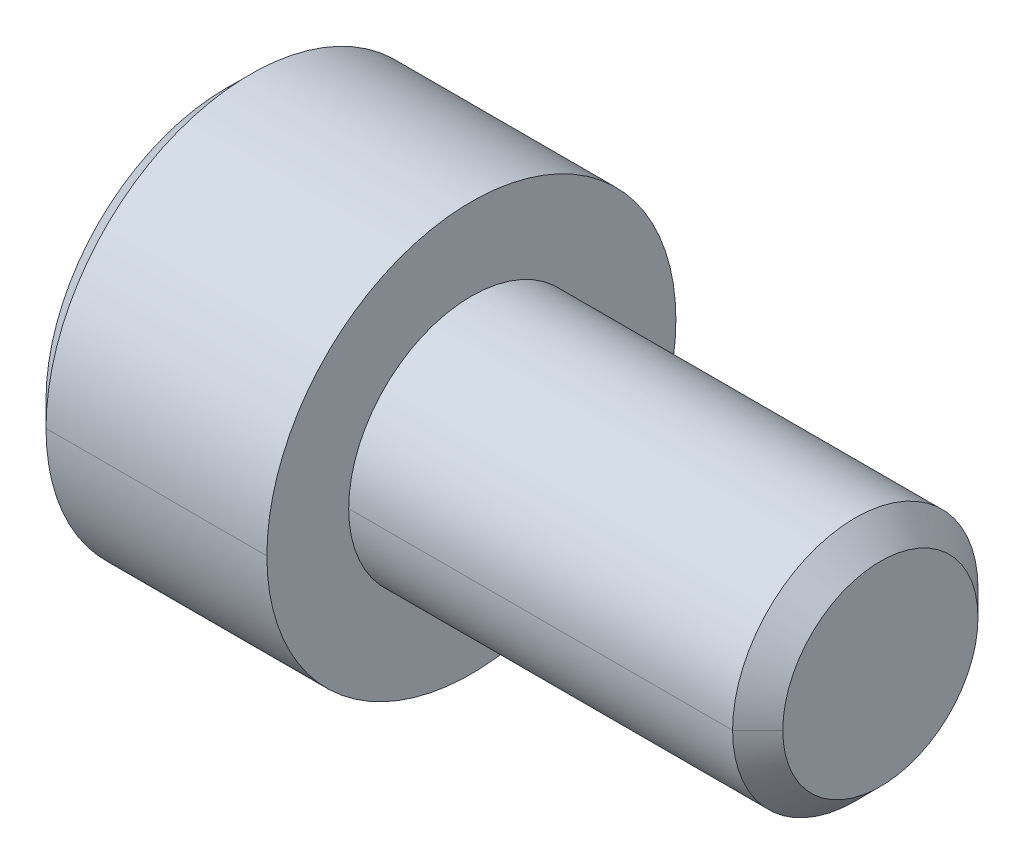
ISO-10303-21;
HEADER;
FILE_DESCRIPTION(('STEP AP214'),'2;1');
FILE_NAME('part.step','',(''),(''),'','','');
FILE_SCHEMA(('AUTOMOTIVE_DESIGN { 1 0 10303 214 1 1 1 1 }'));
ENDSEC;
DATA;
#1=APPLICATION_CONTEXT('core data for automotive mechanical design processes');
#2=APPLICATION_PROTOCOL_DEFINITION('international standard','automotive_design',2000,#1);
#3=PRODUCT_CONTEXT('',#1,'mechanical');
#4=PRODUCT('Part','Part','',(#3));
#5=PRODUCT_RELATED_PRODUCT_CATEGORY('part','',(#4));
#6=PRODUCT_DEFINITION_FORMATION('','',#4);
#7=PRODUCT_DEFINITION_CONTEXT('part definition',#1,'design');
#8=PRODUCT_DEFINITION('design','',#6,#7);
#9=PRODUCT_DEFINITION_SHAPE('','',#8);
#10=(LENGTH_UNIT() NAMED_UNIT(*) SI_UNIT(.MILLI.,.METRE.));
#11=(NAMED_UNIT(*) PLANE_ANGLE_UNIT() SI_UNIT($,.RADIAN.));
#12=(NAMED_UNIT(*) SI_UNIT($,.STERADIAN.) SOLID_ANGLE_UNIT());
#13=UNCERTAINTY_MEASURE_WITH_UNIT(LENGTH_MEASURE(1.E-05),#10,'distance_accuracy_value','');
#14=(GEOMETRIC_REPRESENTATION_CONTEXT(3) GLOBAL_UNCERTAINTY_ASSIGNED_CONTEXT((#13)) GLOBAL_UNIT_ASSIGNED_CONTEXT((#10,
#11,#12)) REPRESENTATION_CONTEXT('',''));
#15=CARTESIAN_POINT('',(0.,0.,0.));
#16=DIRECTION('',(0.,0.,1.));
#17=DIRECTION('',(1.,0.,0.));
#18=AXIS2_PLACEMENT_3D('',#15,#16,#17);
#19=CARTESIAN_POINT('',(-6.,0.,0.));
#20=DIRECTION('',(1.,0.,0.));
#21=DIRECTION('',(0.,-1.,0.));
#22=AXIS2_PLACEMENT_3D('',#19,#20,#21);
#23=CONICAL_SURFACE('',#22,4.4,0.7853981634);
#24=CARTESIAN_POINT('',(-5.4,0.,0.));
#25=DIRECTION('',(1.,0.,0.));
#26=DIRECTION('',(0.,0.,-1.));
#27=AXIS2_PLACEMENT_3D('',#24,#25,#26);
#28=CIRCLE('',#27,5.);
#29=CARTESIAN_POINT('',(-5.4,0.,-5.));
#30=VERTEX_POINT('',#29);
#31=CARTESIAN_POINT('',(-5.40000000000153,0.,5.00000000000153));
#32=VERTEX_POINT('',#31);
#33=EDGE_CURVE('E10',#30,#32,#28,.T.);
#34=ORIENTED_EDGE('',*,*,#33,.F.);
#35=CARTESIAN_POINT('',(-6.,0.,-4.4));
#36=DIRECTION('',(0.707106781184743,0.,-0.707106781188352));
#37=VECTOR('',#36,1.);
#38=LINE('',#35,#37);
#39=CARTESIAN_POINT('',(-6.,0.,-4.4));
#40=VERTEX_POINT('',#39);
#41=EDGE_CURVE('E25',#40,#30,#38,.T.);
#42=ORIENTED_EDGE('',*,*,#41,.F.);
#43=CARTESIAN_POINT('',(-6.,0.,0.));
#44=DIRECTION('',(1.,0.,0.));
#45=DIRECTION('',(0.,0.,-1.));
#46=AXIS2_PLACEMENT_3D('',#43,#44,#45);
#47=CIRCLE('',#46,4.4);
#48=CARTESIAN_POINT('',(-6.,0.,4.4));
#49=VERTEX_POINT('',#48);
#50=EDGE_CURVE('E556',#40,#49,#47,.T.);
#51=ORIENTED_EDGE('',*,*,#50,.T.);
#52=CARTESIAN_POINT('',(-6.,0.,4.4));
#53=DIRECTION('',(0.707106781184743,0.,0.707106781188352));
#54=VECTOR('',#53,1.);
#55=LINE('',#52,#54);
#56=EDGE_CURVE('E543',#49,#32,#55,.T.);
#57=ORIENTED_EDGE('',*,*,#56,.T.);
#58=EDGE_LOOP('',(#34,#42,#51,#57));
#59=FACE_BOUND('',#58,.T.);
#60=ADVANCED_FACE('F16',(#59),#23,.T.);
#61=CARTESIAN_POINT('',(-6.,0.,0.));
#62=DIRECTION('',(1.,0.,0.));
#63=DIRECTION('',(0.,1.,0.));
#64=AXIS2_PLACEMENT_3D('',#61,#62,#63);
#65=CONICAL_SURFACE('',#64,4.4,0.7853981634);
#66=CARTESIAN_POINT('',(-6.,0.,0.));
#67=DIRECTION('',(1.,0.,0.));
#68=DIRECTION('',(0.,0.,-1.));
#69=AXIS2_PLACEMENT_3D('',#66,#67,#68);
#70=CIRCLE('',#69,4.4);
#71=EDGE_CURVE('E541',#49,#40,#70,.T.);
#72=ORIENTED_EDGE('',*,*,#71,.T.);
#73=ORIENTED_EDGE('',*,*,#41,.T.);
#74=CARTESIAN_POINT('',(-5.4,0.,0.));
#75=DIRECTION('',(1.,0.,0.));
#76=DIRECTION('',(0.,0.,-1.));
#77=AXIS2_PLACEMENT_3D('',#74,#75,#76);
#78=CIRCLE('',#77,5.);
#79=EDGE_CURVE('E544',#32,#30,#78,.T.);
#80=ORIENTED_EDGE('',*,*,#79,.F.);
#81=ORIENTED_EDGE('',*,*,#56,.F.);
#82=EDGE_LOOP('',(#72,#73,#80,#81));
#83=FACE_BOUND('',#82,.T.);
#84=ADVANCED_FACE('F518',(#83),#65,.T.);
#85=CARTESIAN_POINT('',(10.,0.,0.));
#86=DIRECTION('',(-1.,0.,0.));
#87=DIRECTION('',(0.,1.,0.));
#88=AXIS2_PLACEMENT_3D('',#85,#86,#87);
#89=CYLINDRICAL_SURFACE('',#88,5.);
#90=ORIENTED_EDGE('',*,*,#79,.T.);
#91=CARTESIAN_POINT('',(0.,0.,-5.));
#92=DIRECTION('',(-1.,0.,0.));
#93=VECTOR('',#92,1.);
#94=LINE('',#91,#93);
#95=CARTESIAN_POINT('',(0.,0.,-5.));
#96=VERTEX_POINT('',#95);
#97=EDGE_CURVE('E481',#96,#30,#94,.T.);
#98=ORIENTED_EDGE('',*,*,#97,.F.);
#99=CARTESIAN_POINT('',(0.,0.,0.));
#100=DIRECTION('',(1.,0.,0.));
#101=DIRECTION('',(0.,0.,-1.));
#102=AXIS2_PLACEMENT_3D('',#99,#100,#101);
#103=CIRCLE('',#102,5.);
#104=CARTESIAN_POINT('',(0.,0.,5.));
#105=VERTEX_POINT('',#104);
#106=EDGE_CURVE('E499',#105,#96,#103,.T.);
#107=ORIENTED_EDGE('',*,*,#106,.F.);
#108=CARTESIAN_POINT('',(0.,0.,5.));
#109=DIRECTION('',(-1.,0.,0.));
#110=VECTOR('',#109,1.);
#111=LINE('',#108,#110);
#112=EDGE_CURVE('E484',#105,#32,#111,.T.);
#113=ORIENTED_EDGE('',*,*,#112,.T.);
#114=EDGE_LOOP('',(#90,#98,#107,#113));
#115=FACE_BOUND('',#114,.T.);
#116=ADVANCED_FACE('F466',(#115),#89,.T.);
#117=CARTESIAN_POINT('',(10.,0.,0.));
#118=DIRECTION('',(-1.,0.,0.));
#119=DIRECTION('',(0.,-1.,0.));
#120=AXIS2_PLACEMENT_3D('',#117,#118,#119);
#121=CYLINDRICAL_SURFACE('',#120,5.);
#122=CARTESIAN_POINT('',(0.,0.,0.));
#123=DIRECTION('',(1.,0.,0.));
#124=DIRECTION('',(0.,0.,-1.));
#125=AXIS2_PLACEMENT_3D('',#122,#123,#124);
#126=CIRCLE('',#125,5.);
#127=EDGE_CURVE('E447',#96,#105,#126,.T.);
#128=ORIENTED_EDGE('',*,*,#127,.F.);
#129=ORIENTED_EDGE('',*,*,#97,.T.);
#130=ORIENTED_EDGE('',*,*,#33,.T.);
#131=ORIENTED_EDGE('',*,*,#112,.F.);
#132=EDGE_LOOP('',(#128,#129,#130,#131));
#133=FACE_BOUND('',#132,.T.);
#134=ADVANCED_FACE('F456',(#133),#121,.T.);
#135=CARTESIAN_POINT('',(0.,5.,0.));
#136=DIRECTION('',(-1.,0.,0.));
#137=DIRECTION('',(0.,0.,1.));
#138=AXIS2_PLACEMENT_3D('',#135,#136,#137);
#139=PLANE('',#138);
#140=CARTESIAN_POINT('',(0.,0.,0.));
#141=DIRECTION('',(1.,0.,0.));
#142=DIRECTION('',(0.,0.,-1.));
#143=AXIS2_PLACEMENT_3D('',#140,#141,#142);
#144=CIRCLE('',#143,3.);
#145=CARTESIAN_POINT('',(0.,0.,-3.));
#146=VERTEX_POINT('',#145);
#147=CARTESIAN_POINT('',(0.,0.,3.));
#148=VERTEX_POINT('',#147);
#149=EDGE_CURVE('E443',#146,#148,#144,.T.);
#150=ORIENTED_EDGE('',*,*,#149,.F.);
#151=CARTESIAN_POINT('',(0.,0.,0.));
#152=DIRECTION('',(1.,0.,0.));
#153=DIRECTION('',(0.,0.,-1.));
#154=AXIS2_PLACEMENT_3D('',#151,#152,#153);
#155=CIRCLE('',#154,3.);
#156=EDGE_CURVE('E441',#148,#146,#155,.T.);
#157=ORIENTED_EDGE('',*,*,#156,.F.);
#158=EDGE_LOOP('',(#150,#157));
#159=FACE_BOUND('',#158,.T.);
#160=ORIENTED_EDGE('',*,*,#127,.T.);
#161=ORIENTED_EDGE('',*,*,#106,.T.);
#162=EDGE_LOOP('',(#160,#161));
#163=FACE_BOUND('',#162,.T.);
#164=ADVANCED_FACE('F465',(#159,#163),#139,.F.);
#165=CARTESIAN_POINT('',(10.,0.,0.));
#166=DIRECTION('',(-1.,0.,0.));
#167=DIRECTION('',(0.,1.,0.));
#168=AXIS2_PLACEMENT_3D('',#165,#166,#167);
#169=CYLINDRICAL_SURFACE('',#168,3.);
#170=ORIENTED_EDGE('',*,*,#156,.T.);
#171=CARTESIAN_POINT('',(9.3865,0.,-3.));
#172=DIRECTION('',(-1.,0.,0.));
#173=VECTOR('',#172,1.);
#174=LINE('',#171,#173);
#175=CARTESIAN_POINT('',(9.3865,0.,-3.));
#176=VERTEX_POINT('',#175);
#177=EDGE_CURVE('E411',#176,#146,#174,.T.);
#178=ORIENTED_EDGE('',*,*,#177,.F.);
#179=CARTESIAN_POINT('',(9.3865,0.,0.));
#180=DIRECTION('',(1.,0.,0.));
#181=DIRECTION('',(0.,0.,-1.));
#182=AXIS2_PLACEMENT_3D('',#179,#180,#181);
#183=CIRCLE('',#182,3.);
#184=CARTESIAN_POINT('',(9.3865,0.,3.));
#185=VERTEX_POINT('',#184);
#186=EDGE_CURVE('E428',#185,#176,#183,.T.);
#187=ORIENTED_EDGE('',*,*,#186,.F.);
#188=CARTESIAN_POINT('',(9.3865,0.,3.));
#189=DIRECTION('',(-1.,0.,0.));
#190=VECTOR('',#189,1.);
#191=LINE('',#188,#190);
#192=EDGE_CURVE('E413',#185,#148,#191,.T.);
#193=ORIENTED_EDGE('',*,*,#192,.T.);
#194=EDGE_LOOP('',(#170,#178,#187,#193));
#195=FACE_BOUND('',#194,.T.);
#196=ADVANCED_FACE('F394',(#195),#169,.T.);
#197=CARTESIAN_POINT('',(10.,0.,0.));
#198=DIRECTION('',(-1.,0.,0.));
#199=DIRECTION('',(0.,-1.,0.));
#200=AXIS2_PLACEMENT_3D('',#197,#198,#199);
#201=CYLINDRICAL_SURFACE('',#200,3.);
#202=CARTESIAN_POINT('',(9.3865,0.,0.));
#203=DIRECTION('',(1.,0.,0.));
#204=DIRECTION('',(0.,0.,-1.));
#205=AXIS2_PLACEMENT_3D('',#202,#203,#204);
#206=CIRCLE('',#205,3.);
#207=EDGE_CURVE('E377',#176,#185,#206,.T.);
#208=ORIENTED_EDGE('',*,*,#207,.F.);
#209=ORIENTED_EDGE('',*,*,#177,.T.);
#210=ORIENTED_EDGE('',*,*,#149,.T.);
#211=ORIENTED_EDGE('',*,*,#192,.F.);
#212=EDGE_LOOP('',(#208,#209,#210,#211));
#213=FACE_BOUND('',#212,.T.);
#214=ADVANCED_FACE('F385',(#213),#201,.T.);
#215=CARTESIAN_POINT('',(9.3865,0.,0.));
#216=DIRECTION('',(-1.,0.,0.));
#217=DIRECTION('',(0.,-1.,0.));
#218=AXIS2_PLACEMENT_3D('',#215,#216,#217);
#219=CONICAL_SURFACE('',#218,3.,0.7853981634);
#220=CARTESIAN_POINT('',(10.,0.,0.));
#221=DIRECTION('',(1.,0.,0.));
#222=DIRECTION('',(0.,0.,-1.));
#223=AXIS2_PLACEMENT_3D('',#220,#221,#222);
#224=CIRCLE('',#223,2.3865);
#225=CARTESIAN_POINT('',(10.,0.,-2.3865));
#226=VERTEX_POINT('',#225);
#227=CARTESIAN_POINT('',(9.99999999999844,0.,2.38649999999843));
#228=VERTEX_POINT('',#227);
#229=EDGE_CURVE('E374',#226,#228,#224,.T.);
#230=ORIENTED_EDGE('',*,*,#229,.F.);
#231=CARTESIAN_POINT('',(9.99999999999843,0.,-2.38649999999843));
#232=DIRECTION('',(-0.707106781184743,0.,-0.707106781188352));
#233=VECTOR('',#232,1.);
#234=LINE('',#231,#233);
#235=EDGE_CURVE('E351',#226,#176,#234,.T.);
#236=ORIENTED_EDGE('',*,*,#235,.T.);
#237=ORIENTED_EDGE('',*,*,#207,.T.);
#238=CARTESIAN_POINT('',(9.99999999999843,0.,2.38649999999843));
#239=DIRECTION('',(-0.707106781184743,0.,0.707106781188352));
#240=VECTOR('',#239,1.);
#241=LINE('',#238,#240);
#242=EDGE_CURVE('E364',#228,#185,#241,.T.);
#243=ORIENTED_EDGE('',*,*,#242,.F.);
#244=EDGE_LOOP('',(#230,#236,#237,#243));
#245=FACE_BOUND('',#244,.T.);
#246=ADVANCED_FACE('F329',(#245),#219,.T.);
#247=CARTESIAN_POINT('',(9.3865,0.,0.));
#248=DIRECTION('',(-1.,0.,0.));
#249=DIRECTION('',(0.,1.,0.));
#250=AXIS2_PLACEMENT_3D('',#247,#248,#249);
#251=CONICAL_SURFACE('',#250,3.,0.7853981634);
#252=ORIENTED_EDGE('',*,*,#186,.T.);
#253=ORIENTED_EDGE('',*,*,#235,.F.);
#254=CARTESIAN_POINT('',(10.,0.,0.));
#255=DIRECTION('',(1.,0.,0.));
#256=DIRECTION('',(0.,0.,-1.));
#257=AXIS2_PLACEMENT_3D('',#254,#255,#256);
#258=CIRCLE('',#257,2.3865);
#259=EDGE_CURVE('E309',#228,#226,#258,.T.);
#260=ORIENTED_EDGE('',*,*,#259,.F.);
#261=ORIENTED_EDGE('',*,*,#242,.T.);
#262=EDGE_LOOP('',(#252,#253,#260,#261));
#263=FACE_BOUND('',#262,.T.);
#264=ADVANCED_FACE('F318',(#263),#251,.T.);
#265=CARTESIAN_POINT('',(10.,2.3865,0.));
#266=DIRECTION('',(-1.,0.,0.));
#267=DIRECTION('',(0.,0.,1.));
#268=AXIS2_PLACEMENT_3D('',#265,#266,#267);
#269=PLANE('',#268);
#270=ORIENTED_EDGE('',*,*,#229,.T.);
#271=ORIENTED_EDGE('',*,*,#259,.T.);
#272=EDGE_LOOP('',(#270,#271));
#273=FACE_BOUND('',#272,.T.);
#274=ADVANCED_FACE('F328',(#273),#269,.F.);
#275=CARTESIAN_POINT('',(-6.,0.,0.));
#276=DIRECTION('',(1.,0.,0.));
#277=DIRECTION('',(0.,0.,-1.));
#278=AXIS2_PLACEMENT_3D('',#275,#276,#277);
#279=PLANE('',#278);
#280=ORIENTED_EDGE('',*,*,#50,.F.);
#281=ORIENTED_EDGE('',*,*,#71,.F.);
#282=EDGE_LOOP('',(#280,#281));
#283=FACE_BOUND('',#282,.T.);
#284=DIRECTION('',(0.,0.499999999999983,-0.866025403784448));
#285=VECTOR('',#284,1.);
#286=CARTESIAN_POINT('',(-6.,-2.8867513459481,0.));
#287=LINE('',#286,#285);
#288=CARTESIAN_POINT('',(-6.,-2.8867513459481,0.));
#289=VERTEX_POINT('',#288);
#290=CARTESIAN_POINT('',(-6.,-1.4433756729741,-2.5));
#291=VERTEX_POINT('',#290);
#292=EDGE_CURVE('E305',#289,#291,#287,.T.);
#293=ORIENTED_EDGE('',*,*,#292,.T.);
#294=DIRECTION('',(0.,1.,0.));
#295=VECTOR('',#294,1.);
#296=CARTESIAN_POINT('',(-6.,-1.4433756729741,-2.5));
#297=LINE('',#296,#295);
#298=CARTESIAN_POINT('',(-6.,1.4433756729741,-2.5));
#299=VERTEX_POINT('',#298);
#300=EDGE_CURVE('E301',#291,#299,#297,.T.);
#301=ORIENTED_EDGE('',*,*,#300,.T.);
#302=DIRECTION('',(0.,0.499999999999983,0.866025403784448));
#303=VECTOR('',#302,1.);
#304=CARTESIAN_POINT('',(-6.,1.4433756729741,-2.5));
#305=LINE('',#304,#303);
#306=CARTESIAN_POINT('',(-6.,2.8867513459481,0.));
#307=VERTEX_POINT('',#306);
#308=EDGE_CURVE('E297',#299,#307,#305,.T.);
#309=ORIENTED_EDGE('',*,*,#308,.T.);
#310=DIRECTION('',(0.,-0.499999999999983,0.866025403784448));
#311=VECTOR('',#310,1.);
#312=CARTESIAN_POINT('',(-6.,2.8867513459481,0.));
#313=LINE('',#312,#311);
#314=CARTESIAN_POINT('',(-6.,1.4433756729741,2.5));
#315=VERTEX_POINT('',#314);
#316=EDGE_CURVE('E293',#307,#315,#313,.T.);
#317=ORIENTED_EDGE('',*,*,#316,.T.);
#318=DIRECTION('',(0.,-1.,0.));
#319=VECTOR('',#318,1.);
#320=CARTESIAN_POINT('',(-6.,1.4433756729741,2.5));
#321=LINE('',#320,#319);
#322=CARTESIAN_POINT('',(-6.,-1.4433756729741,2.5));
#323=VERTEX_POINT('',#322);
#324=EDGE_CURVE('E289',#315,#323,#321,.T.);
#325=ORIENTED_EDGE('',*,*,#324,.T.);
#326=DIRECTION('',(0.,-0.499999999999983,-0.866025403784448));
#327=VECTOR('',#326,1.);
#328=CARTESIAN_POINT('',(-6.,-1.4433756729741,2.5));
#329=LINE('',#328,#327);
#330=EDGE_CURVE('E285',#323,#289,#329,.T.);
#331=ORIENTED_EDGE('',*,*,#330,.T.);
#332=EDGE_LOOP('',(#293,#301,#309,#317,#325,#331));
#333=FACE_BOUND('',#332,.T.);
#334=ADVANCED_FACE('F570',(#283,#333),#279,.F.);
#335=CARTESIAN_POINT('',(-3.,-1.4433756729741,2.5));
#336=DIRECTION('',(0.,0.866025403784448,-0.499999999999983));
#337=DIRECTION('',(0.,0.499999999999983,0.866025403784448));
#338=AXIS2_PLACEMENT_3D('',#335,#336,#337);
#339=PLANE('',#338);
#340=ORIENTED_EDGE('',*,*,#330,.F.);
#341=DIRECTION('',(-1.,0.,0.));
#342=VECTOR('',#341,1.);
#343=CARTESIAN_POINT('',(-3.,-1.4433756729741,2.5));
#344=LINE('',#343,#342);
#345=CARTESIAN_POINT('',(-3.,-1.4433756729741,2.5));
#346=VERTEX_POINT('',#345);
#347=EDGE_CURVE('E280',#346,#323,#344,.T.);
#348=ORIENTED_EDGE('',*,*,#347,.F.);
#349=DIRECTION('',(0.,-0.499999999999983,-0.866025403784448));
#350=VECTOR('',#349,1.);
#351=CARTESIAN_POINT('',(-3.,-1.4433756729741,2.5));
#352=LINE('',#351,#350);
#353=CARTESIAN_POINT('',(-3.,-2.16506350946112,1.24999999999996));
#354=VERTEX_POINT('',#353);
#355=EDGE_CURVE('E276',#346,#354,#352,.T.);
#356=ORIENTED_EDGE('',*,*,#355,.T.);
#357=DIRECTION('',(0.,-0.499999999999983,-0.866025403784448));
#358=VECTOR('',#357,1.);
#359=CARTESIAN_POINT('',(-3.,-1.4433756729741,2.5));
#360=LINE('',#359,#358);
#361=CARTESIAN_POINT('',(-3.,-2.8867513459481,0.));
#362=VERTEX_POINT('',#361);
#363=EDGE_CURVE('E272',#354,#362,#360,.T.);
#364=ORIENTED_EDGE('',*,*,#363,.T.);
#365=DIRECTION('',(-1.,0.,0.));
#366=VECTOR('',#365,1.);
#367=CARTESIAN_POINT('',(-3.,-2.8867513459481,0.));
#368=LINE('',#367,#366);
#369=EDGE_CURVE('E267',#362,#289,#368,.T.);
#370=ORIENTED_EDGE('',*,*,#369,.T.);
#371=EDGE_LOOP('',(#340,#348,#356,#364,#370));
#372=FACE_BOUND('',#371,.T.);
#373=ADVANCED_FACE('F573',(#372),#339,.T.);
#374=CARTESIAN_POINT('',(-3.,-2.8867513459481,0.));
#375=DIRECTION('',(0.,0.866025403784448,0.499999999999983));
#376=DIRECTION('',(0.,-0.499999999999983,0.866025403784448));
#377=AXIS2_PLACEMENT_3D('',#374,#375,#376);
#378=PLANE('',#377);
#379=ORIENTED_EDGE('',*,*,#292,.F.);
#380=ORIENTED_EDGE('',*,*,#369,.F.);
#381=DIRECTION('',(0.,0.499999999999983,-0.866025403784448));
#382=VECTOR('',#381,1.);
#383=CARTESIAN_POINT('',(-3.,-2.8867513459481,0.));
#384=LINE('',#383,#382);
#385=CARTESIAN_POINT('',(-3.,-2.16506350946112,-1.24999999999996));
#386=VERTEX_POINT('',#385);
#387=EDGE_CURVE('E263',#362,#386,#384,.T.);
#388=ORIENTED_EDGE('',*,*,#387,.T.);
#389=DIRECTION('',(0.,0.499999999999983,-0.866025403784448));
#390=VECTOR('',#389,1.);
#391=CARTESIAN_POINT('',(-3.,-2.8867513459481,0.));
#392=LINE('',#391,#390);
#393=CARTESIAN_POINT('',(-3.,-1.4433756729741,-2.5));
#394=VERTEX_POINT('',#393);
#395=EDGE_CURVE('E259',#386,#394,#392,.T.);
#396=ORIENTED_EDGE('',*,*,#395,.T.);
#397=DIRECTION('',(-1.,0.,0.));
#398=VECTOR('',#397,1.);
#399=CARTESIAN_POINT('',(-3.,-1.4433756729741,-2.5));
#400=LINE('',#399,#398);
#401=EDGE_CURVE('E254',#394,#291,#400,.T.);
#402=ORIENTED_EDGE('',*,*,#401,.T.);
#403=EDGE_LOOP('',(#379,#380,#388,#396,#402));
#404=FACE_BOUND('',#403,.T.);
#405=ADVANCED_FACE('F580',(#404),#378,.T.);
#406=CARTESIAN_POINT('',(-3.,-1.4433756729741,-2.5));
#407=DIRECTION('',(0.,0.,1.));
#408=DIRECTION('',(1.,0.,0.));
#409=AXIS2_PLACEMENT_3D('',#406,#407,#408);
#410=PLANE('',#409);
#411=ORIENTED_EDGE('',*,*,#300,.F.);
#412=ORIENTED_EDGE('',*,*,#401,.F.);
#413=DIRECTION('',(0.,1.,0.));
#414=VECTOR('',#413,1.);
#415=CARTESIAN_POINT('',(-3.,-1.4433756729741,-2.5));
#416=LINE('',#415,#414);
#417=CARTESIAN_POINT('',(-3.,0.,-2.5));
#418=VERTEX_POINT('',#417);
#419=EDGE_CURVE('E250',#394,#418,#416,.T.);
#420=ORIENTED_EDGE('',*,*,#419,.T.);
#421=DIRECTION('',(0.,1.,0.));
#422=VECTOR('',#421,1.);
#423=CARTESIAN_POINT('',(-3.,-1.4433756729741,-2.5));
#424=LINE('',#423,#422);
#425=CARTESIAN_POINT('',(-3.,1.4433756729741,-2.5));
#426=VERTEX_POINT('',#425);
#427=EDGE_CURVE('E246',#418,#426,#424,.T.);
#428=ORIENTED_EDGE('',*,*,#427,.T.);
#429=DIRECTION('',(-1.,0.,0.));
#430=VECTOR('',#429,1.);
#431=CARTESIAN_POINT('',(-3.,1.4433756729741,-2.5));
#432=LINE('',#431,#430);
#433=EDGE_CURVE('E241',#426,#299,#432,.T.);
#434=ORIENTED_EDGE('',*,*,#433,.T.);
#435=EDGE_LOOP('',(#411,#412,#420,#428,#434));
#436=FACE_BOUND('',#435,.T.);
#437=ADVANCED_FACE('F584',(#436),#410,.T.);
#438=CARTESIAN_POINT('',(-3.,1.4433756729741,-2.5));
#439=DIRECTION('',(0.,-0.866025403784448,0.499999999999983));
#440=DIRECTION('',(0.,-0.499999999999983,-0.866025403784448));
#441=AXIS2_PLACEMENT_3D('',#438,#439,#440);
#442=PLANE('',#441);
#443=ORIENTED_EDGE('',*,*,#308,.F.);
#444=ORIENTED_EDGE('',*,*,#433,.F.);
#445=DIRECTION('',(0.,0.499999999999983,0.866025403784448));
#446=VECTOR('',#445,1.);
#447=CARTESIAN_POINT('',(-3.,1.4433756729741,-2.5));
#448=LINE('',#447,#446);
#449=CARTESIAN_POINT('',(-3.,2.16506350946112,-1.24999999999996));
#450=VERTEX_POINT('',#449);
#451=EDGE_CURVE('E237',#426,#450,#448,.T.);
#452=ORIENTED_EDGE('',*,*,#451,.T.);
#453=DIRECTION('',(0.,0.499999999999983,0.866025403784448));
#454=VECTOR('',#453,1.);
#455=CARTESIAN_POINT('',(-3.,1.4433756729741,-2.5));
#456=LINE('',#455,#454);
#457=CARTESIAN_POINT('',(-3.,2.8867513459481,0.));
#458=VERTEX_POINT('',#457);
#459=EDGE_CURVE('E233',#450,#458,#456,.T.);
#460=ORIENTED_EDGE('',*,*,#459,.T.);
#461=DIRECTION('',(-1.,0.,0.));
#462=VECTOR('',#461,1.);
#463=CARTESIAN_POINT('',(-3.,2.8867513459481,0.));
#464=LINE('',#463,#462);
#465=EDGE_CURVE('E228',#458,#307,#464,.T.);
#466=ORIENTED_EDGE('',*,*,#465,.T.);
#467=EDGE_LOOP('',(#443,#444,#452,#460,#466));
#468=FACE_BOUND('',#467,.T.);
#469=ADVANCED_FACE('F589',(#468),#442,.T.);
#470=CARTESIAN_POINT('',(-3.,2.8867513459481,0.));
#471=DIRECTION('',(0.,-0.866025403784448,-0.499999999999983));
#472=DIRECTION('',(0.,0.499999999999983,-0.866025403784448));
#473=AXIS2_PLACEMENT_3D('',#470,#471,#472);
#474=PLANE('',#473);
#475=ORIENTED_EDGE('',*,*,#316,.F.);
#476=ORIENTED_EDGE('',*,*,#465,.F.);
#477=DIRECTION('',(0.,-0.499999999999983,0.866025403784448));
#478=VECTOR('',#477,1.);
#479=CARTESIAN_POINT('',(-3.,2.8867513459481,0.));
#480=LINE('',#479,#478);
#481=CARTESIAN_POINT('',(-3.,2.16506350946112,1.24999999999996));
#482=VERTEX_POINT('',#481);
#483=EDGE_CURVE('E224',#458,#482,#480,.T.);
#484=ORIENTED_EDGE('',*,*,#483,.T.);
#485=DIRECTION('',(0.,-0.499999999999983,0.866025403784448));
#486=VECTOR('',#485,1.);
#487=CARTESIAN_POINT('',(-3.,2.8867513459481,0.));
#488=LINE('',#487,#486);
#489=CARTESIAN_POINT('',(-3.,1.4433756729741,2.5));
#490=VERTEX_POINT('',#489);
#491=EDGE_CURVE('E220',#482,#490,#488,.T.);
#492=ORIENTED_EDGE('',*,*,#491,.T.);
#493=DIRECTION('',(-1.,0.,0.));
#494=VECTOR('',#493,1.);
#495=CARTESIAN_POINT('',(-3.,1.4433756729741,2.5));
#496=LINE('',#495,#494);
#497=EDGE_CURVE('E215',#490,#315,#496,.T.);
#498=ORIENTED_EDGE('',*,*,#497,.T.);
#499=EDGE_LOOP('',(#475,#476,#484,#492,#498));
#500=FACE_BOUND('',#499,.T.);
#501=ADVANCED_FACE('F595',(#500),#474,.T.);
#502=CARTESIAN_POINT('',(-3.,1.4433756729741,2.5));
#503=DIRECTION('',(0.,0.,-1.));
#504=DIRECTION('',(-1.,0.,0.));
#505=AXIS2_PLACEMENT_3D('',#502,#503,#504);
#506=PLANE('',#505);
#507=ORIENTED_EDGE('',*,*,#324,.F.);
#508=ORIENTED_EDGE('',*,*,#497,.F.);
#509=DIRECTION('',(0.,-1.,0.));
#510=VECTOR('',#509,1.);
#511=CARTESIAN_POINT('',(-3.,1.4433756729741,2.5));
#512=LINE('',#511,#510);
#513=CARTESIAN_POINT('',(-3.,0.,2.5));
#514=VERTEX_POINT('',#513);
#515=EDGE_CURVE('E211',#490,#514,#512,.T.);
#516=ORIENTED_EDGE('',*,*,#515,.T.);
#517=DIRECTION('',(0.,-1.,0.));
#518=VECTOR('',#517,1.);
#519=CARTESIAN_POINT('',(-3.,1.4433756729741,2.5));
#520=LINE('',#519,#518);
#521=EDGE_CURVE('E206',#514,#346,#520,.T.);
#522=ORIENTED_EDGE('',*,*,#521,.T.);
#523=ORIENTED_EDGE('',*,*,#347,.T.);
#524=EDGE_LOOP('',(#507,#508,#516,#522,#523));
#525=FACE_BOUND('',#524,.T.);
#526=ADVANCED_FACE('F599',(#525),#506,.T.);
#527=CARTESIAN_POINT('',(-3.,0.,0.));
#528=DIRECTION('',(1.,0.,0.));
#529=DIRECTION('',(0.,0.,-1.));
#530=AXIS2_PLACEMENT_3D('',#527,#528,#529);
#531=PLANE('',#530);
#532=CARTESIAN_POINT('',(-3.,0.,0.));
#533=DIRECTION('',(1.,0.,0.));
#534=DIRECTION('',(0.,0.,-1.));
#535=AXIS2_PLACEMENT_3D('',#532,#533,#534);
#536=CIRCLE('',#535,2.5);
#537=EDGE_CURVE('E134',#514,#354,#536,.T.);
#538=ORIENTED_EDGE('',*,*,#537,.T.);
#539=ORIENTED_EDGE('',*,*,#355,.F.);
#540=ORIENTED_EDGE('',*,*,#521,.F.);
#541=EDGE_LOOP('',(#538,#539,#540));
#542=FACE_BOUND('',#541,.T.);
#543=ADVANCED_FACE('F183',(#542),#531,.F.);
#544=CARTESIAN_POINT('',(-3.,0.,0.));
#545=DIRECTION('',(-1.,0.,0.));
#546=DIRECTION('',(0.,1.,0.));
#547=AXIS2_PLACEMENT_3D('',#544,#545,#546);
#548=CONICAL_SURFACE('',#547,2.5,1.0471975512);
#549=CARTESIAN_POINT('',(-1.55662432703728,0.,0.));
#550=DIRECTION('',(-0.499999999997054,0.,-0.86602540378614));
#551=VECTOR('',#550,1.);
#552=LINE('',#549,#551);
#553=CARTESIAN_POINT('',(-1.5566243270259,0.,0.));
#554=VERTEX_POINT('',#553);
#555=EDGE_CURVE('E129',#554,#418,#552,.T.);
#556=ORIENTED_EDGE('',*,*,#555,.T.);
#557=CARTESIAN_POINT('',(-3.,0.,0.));
#558=DIRECTION('',(1.,0.,0.));
#559=DIRECTION('',(0.,0.,-1.));
#560=AXIS2_PLACEMENT_3D('',#557,#558,#559);
#561=CIRCLE('',#560,2.5);
#562=EDGE_CURVE('E149',#386,#418,#561,.T.);
#563=ORIENTED_EDGE('',*,*,#562,.F.);
#564=CARTESIAN_POINT('',(-3.,0.,0.));
#565=DIRECTION('',(1.,0.,0.));
#566=DIRECTION('',(0.,0.,-1.));
#567=AXIS2_PLACEMENT_3D('',#564,#565,#566);
#568=CIRCLE('',#567,2.5);
#569=EDGE_CURVE('E139',#354,#386,#568,.T.);
#570=ORIENTED_EDGE('',*,*,#569,.F.);
#571=ORIENTED_EDGE('',*,*,#537,.F.);
#572=CARTESIAN_POINT('',(-1.55662432703728,0.,0.));
#573=DIRECTION('',(-0.499999999997054,0.,0.86602540378614));
#574=VECTOR('',#573,1.);
#575=LINE('',#572,#574);
#576=EDGE_CURVE('E124',#554,#514,#575,.T.);
#577=ORIENTED_EDGE('',*,*,#576,.F.);
#578=EDGE_LOOP('',(#556,#563,#570,#571,#577));
#579=FACE_BOUND('',#578,.T.);
#580=ADVANCED_FACE('F127',(#579),#548,.F.);
#581=CARTESIAN_POINT('',(-3.,0.,0.));
#582=DIRECTION('',(-1.,0.,0.));
#583=DIRECTION('',(0.,-1.,0.));
#584=AXIS2_PLACEMENT_3D('',#581,#582,#583);
#585=CONICAL_SURFACE('',#584,2.5,1.0471975512);
#586=ORIENTED_EDGE('',*,*,#576,.T.);
#587=CARTESIAN_POINT('',(-3.,0.,0.));
#588=DIRECTION('',(1.,0.,0.));
#589=DIRECTION('',(0.,0.,-1.));
#590=AXIS2_PLACEMENT_3D('',#587,#588,#589);
#591=CIRCLE('',#590,2.5);
#592=EDGE_CURVE('E140',#482,#514,#591,.T.);
#593=ORIENTED_EDGE('',*,*,#592,.F.);
#594=CARTESIAN_POINT('',(-3.,0.,0.));
#595=DIRECTION('',(1.,0.,0.));
#596=DIRECTION('',(0.,0.,-1.));
#597=AXIS2_PLACEMENT_3D('',#594,#595,#596);
#598=CIRCLE('',#597,2.5);
#599=EDGE_CURVE('E156',#450,#482,#598,.T.);
#600=ORIENTED_EDGE('',*,*,#599,.F.);
#601=CARTESIAN_POINT('',(-3.,0.,0.));
#602=DIRECTION('',(1.,0.,0.));
#603=DIRECTION('',(0.,0.,-1.));
#604=AXIS2_PLACEMENT_3D('',#601,#602,#603);
#605=CIRCLE('',#604,2.5);
#606=EDGE_CURVE('E147',#418,#450,#605,.T.);
#607=ORIENTED_EDGE('',*,*,#606,.F.);
#608=ORIENTED_EDGE('',*,*,#555,.F.);
#609=EDGE_LOOP('',(#586,#593,#600,#607,#608));
#610=FACE_BOUND('',#609,.T.);
#611=ADVANCED_FACE('F144',(#610),#585,.F.);
#612=CARTESIAN_POINT('',(-3.,0.,0.));
#613=DIRECTION('',(1.,0.,0.));
#614=DIRECTION('',(0.,0.,-1.));
#615=AXIS2_PLACEMENT_3D('',#612,#613,#614);
#616=PLANE('',#615);
#617=ORIENTED_EDGE('',*,*,#606,.T.);
#618=ORIENTED_EDGE('',*,*,#451,.F.);
#619=ORIENTED_EDGE('',*,*,#427,.F.);
#620=EDGE_LOOP('',(#617,#618,#619));
#621=FACE_BOUND('',#620,.T.);
#622=ADVANCED_FACE('F177',(#621),#616,.F.);
#623=CARTESIAN_POINT('',(-3.,0.,0.));
#624=DIRECTION('',(1.,0.,0.));
#625=DIRECTION('',(0.,0.,-1.));
#626=AXIS2_PLACEMENT_3D('',#623,#624,#625);
#627=PLANE('',#626);
#628=ORIENTED_EDGE('',*,*,#459,.F.);
#629=ORIENTED_EDGE('',*,*,#599,.T.);
#630=ORIENTED_EDGE('',*,*,#483,.F.);
#631=EDGE_LOOP('',(#628,#629,#630));
#632=FACE_BOUND('',#631,.T.);
#633=ADVANCED_FACE('F728',(#632),#627,.F.);
#634=CARTESIAN_POINT('',(-3.,0.,0.));
#635=DIRECTION('',(1.,0.,0.));
#636=DIRECTION('',(0.,0.,-1.));
#637=AXIS2_PLACEMENT_3D('',#634,#635,#636);
#638=PLANE('',#637);
#639=ORIENTED_EDGE('',*,*,#592,.T.);
#640=ORIENTED_EDGE('',*,*,#515,.F.);
#641=ORIENTED_EDGE('',*,*,#491,.F.);
#642=EDGE_LOOP('',(#639,#640,#641));
#643=FACE_BOUND('',#642,.T.);
#644=ADVANCED_FACE('F619',(#643),#638,.F.);
#645=CARTESIAN_POINT('',(-3.,0.,0.));
#646=DIRECTION('',(1.,0.,0.));
#647=DIRECTION('',(0.,0.,-1.));
#648=AXIS2_PLACEMENT_3D('',#645,#646,#647);
#649=PLANE('',#648);
#650=ORIENTED_EDGE('',*,*,#569,.T.);
#651=ORIENTED_EDGE('',*,*,#387,.F.);
#652=ORIENTED_EDGE('',*,*,#363,.F.);
#653=EDGE_LOOP('',(#650,#651,#652));
#654=FACE_BOUND('',#653,.T.);
#655=ADVANCED_FACE('F607',(#654),#649,.F.);
#656=CARTESIAN_POINT('',(-3.,0.,0.));
#657=DIRECTION('',(1.,0.,0.));
#658=DIRECTION('',(0.,0.,-1.));
#659=AXIS2_PLACEMENT_3D('',#656,#657,#658);
#660=PLANE('',#659);
#661=ORIENTED_EDGE('',*,*,#562,.T.);
#662=ORIENTED_EDGE('',*,*,#419,.F.);
#663=ORIENTED_EDGE('',*,*,#395,.F.);
#664=EDGE_LOOP('',(#661,#662,#663));
#665=FACE_BOUND('',#664,.T.);
#666=ADVANCED_FACE('F610',(#665),#660,.F.);
#667=CLOSED_SHELL('',(#60,#84,#116,#134,#164,#196,#214,#246,#264,#274,#334,#373,#405,#437,#469,
#501,#526,#543,#580,#611,#622,#633,#644,#655,#666));
#668=MANIFOLD_SOLID_BREP('B1',#667);
#669=ADVANCED_BREP_SHAPE_REPRESENTATION('',(#18,#668),#14);
#670=SHAPE_DEFINITION_REPRESENTATION(#9,#669);
ENDSEC;
END-ISO-10303-21;
